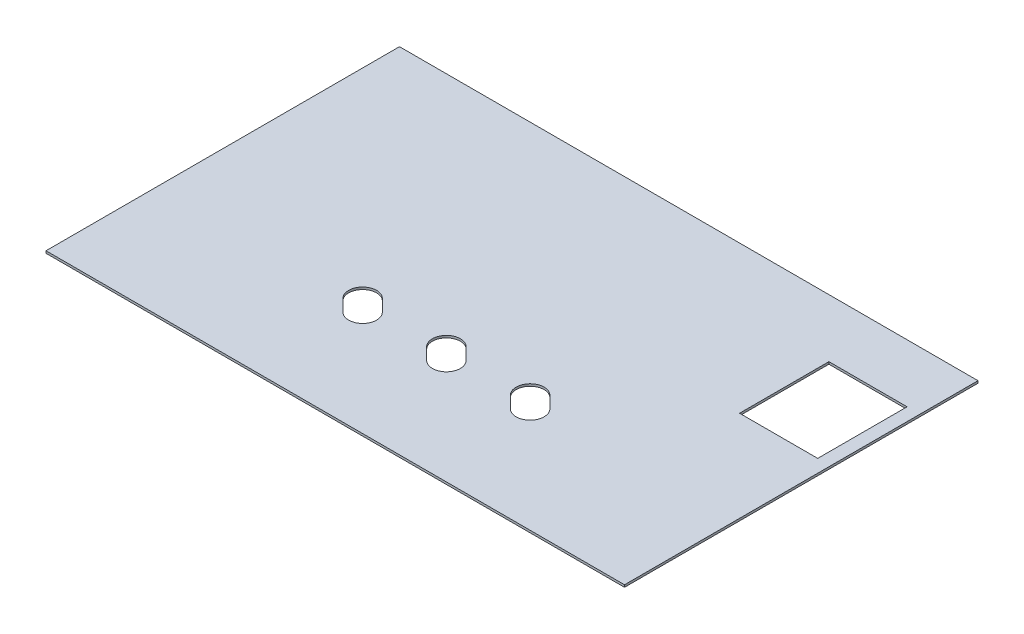
ISO-10303-21;
HEADER;
FILE_DESCRIPTION(('STEP AP214'),'2;1');
FILE_NAME('part.step','',(''),(''),'','','');
FILE_SCHEMA(('AUTOMOTIVE_DESIGN { 1 0 10303 214 1 1 1 1 }'));
ENDSEC;
DATA;
#1=APPLICATION_CONTEXT('core data for automotive mechanical design processes');
#2=APPLICATION_PROTOCOL_DEFINITION('international standard','automotive_design',2000,#1);
#3=PRODUCT_CONTEXT('',#1,'mechanical');
#4=PRODUCT('Part','Part','',(#3));
#5=PRODUCT_RELATED_PRODUCT_CATEGORY('part','',(#4));
#6=PRODUCT_DEFINITION_FORMATION('','',#4);
#7=PRODUCT_DEFINITION_CONTEXT('part definition',#1,'design');
#8=PRODUCT_DEFINITION('design','',#6,#7);
#9=PRODUCT_DEFINITION_SHAPE('','',#8);
#10=(LENGTH_UNIT() NAMED_UNIT(*) SI_UNIT(.MILLI.,.METRE.));
#11=(NAMED_UNIT(*) PLANE_ANGLE_UNIT() SI_UNIT($,.RADIAN.));
#12=(NAMED_UNIT(*) SI_UNIT($,.STERADIAN.) SOLID_ANGLE_UNIT());
#13=UNCERTAINTY_MEASURE_WITH_UNIT(LENGTH_MEASURE(1.E-05),#10,'distance_accuracy_value','');
#14=(GEOMETRIC_REPRESENTATION_CONTEXT(3) GLOBAL_UNCERTAINTY_ASSIGNED_CONTEXT((#13)) GLOBAL_UNIT_ASSIGNED_CONTEXT((#10,
#11,#12)) REPRESENTATION_CONTEXT('',''));
#15=CARTESIAN_POINT('',(0.,0.,0.));
#16=DIRECTION('',(0.,0.,1.));
#17=DIRECTION('',(1.,0.,0.));
#18=AXIS2_PLACEMENT_3D('',#15,#16,#17);
#19=CARTESIAN_POINT('',(51.8,-0.4,-31.65));
#20=DIRECTION('',(1.,0.,0.));
#21=DIRECTION('',(0.,0.,-1.));
#22=AXIS2_PLACEMENT_3D('',#19,#20,#21);
#23=PLANE('',#22);
#24=DIRECTION('',(0.,0.,-1.));
#25=VECTOR('',#24,1.);
#26=CARTESIAN_POINT('',(51.8,0.,-31.65));
#27=LINE('',#26,#25);
#28=CARTESIAN_POINT('',(51.8,0.,31.65));
#29=VERTEX_POINT('',#28);
#30=CARTESIAN_POINT('',(51.8,0.,-31.65));
#31=VERTEX_POINT('',#30);
#32=EDGE_CURVE('E296',#29,#31,#27,.T.);
#33=ORIENTED_EDGE('',*,*,#32,.F.);
#34=DIRECTION('',(0.,1.,0.));
#35=VECTOR('',#34,1.);
#36=CARTESIAN_POINT('',(51.8,-0.4,31.65));
#37=LINE('',#36,#35);
#38=CARTESIAN_POINT('',(51.8,-0.4,31.65));
#39=VERTEX_POINT('',#38);
#40=EDGE_CURVE('E11',#39,#29,#37,.T.);
#41=ORIENTED_EDGE('',*,*,#40,.F.);
#42=DIRECTION('',(0.,0.,-1.));
#43=VECTOR('',#42,1.);
#44=CARTESIAN_POINT('',(51.8,-0.4,-31.65));
#45=LINE('',#44,#43);
#46=CARTESIAN_POINT('',(51.8,-0.4,-31.65));
#47=VERTEX_POINT('',#46);
#48=EDGE_CURVE('E303',#39,#47,#45,.T.);
#49=ORIENTED_EDGE('',*,*,#48,.T.);
#50=DIRECTION('',(0.,1.,0.));
#51=VECTOR('',#50,1.);
#52=CARTESIAN_POINT('',(51.8,-0.4,-31.65));
#53=LINE('',#52,#51);
#54=EDGE_CURVE('E36',#47,#31,#53,.T.);
#55=ORIENTED_EDGE('',*,*,#54,.T.);
#56=EDGE_LOOP('',(#33,#41,#49,#55));
#57=FACE_BOUND('',#56,.T.);
#58=ADVANCED_FACE('F33',(#57),#23,.T.);
#59=CARTESIAN_POINT('',(-51.8,-0.4,31.65));
#60=DIRECTION('',(0.,0.,1.));
#61=DIRECTION('',(1.,0.,0.));
#62=AXIS2_PLACEMENT_3D('',#59,#60,#61);
#63=PLANE('',#62);
#64=DIRECTION('',(1.,0.,0.));
#65=VECTOR('',#64,1.);
#66=CARTESIAN_POINT('',(-51.8,0.,31.65));
#67=LINE('',#66,#65);
#68=CARTESIAN_POINT('',(-51.8,0.,31.65));
#69=VERTEX_POINT('',#68);
#70=EDGE_CURVE('E307',#69,#29,#67,.T.);
#71=ORIENTED_EDGE('',*,*,#70,.F.);
#72=DIRECTION('',(0.,1.,0.));
#73=VECTOR('',#72,1.);
#74=CARTESIAN_POINT('',(-51.8,-0.4,31.65));
#75=LINE('',#74,#73);
#76=CARTESIAN_POINT('',(-51.8,-0.4,31.65));
#77=VERTEX_POINT('',#76);
#78=EDGE_CURVE('E41',#77,#69,#75,.T.);
#79=ORIENTED_EDGE('',*,*,#78,.F.);
#80=DIRECTION('',(1.,0.,0.));
#81=VECTOR('',#80,1.);
#82=CARTESIAN_POINT('',(-51.8,-0.4,31.65));
#83=LINE('',#82,#81);
#84=EDGE_CURVE('E313',#77,#39,#83,.T.);
#85=ORIENTED_EDGE('',*,*,#84,.T.);
#86=ORIENTED_EDGE('',*,*,#40,.T.);
#87=EDGE_LOOP('',(#71,#79,#85,#86));
#88=FACE_BOUND('',#87,.T.);
#89=ADVANCED_FACE('F338',(#88),#63,.T.);
#90=CARTESIAN_POINT('',(-51.8,-0.4,-31.65));
#91=DIRECTION('',(-1.,0.,0.));
#92=DIRECTION('',(0.,0.,1.));
#93=AXIS2_PLACEMENT_3D('',#90,#91,#92);
#94=PLANE('',#93);
#95=DIRECTION('',(0.,0.,1.));
#96=VECTOR('',#95,1.);
#97=CARTESIAN_POINT('',(-51.8,0.,-31.65));
#98=LINE('',#97,#96);
#99=CARTESIAN_POINT('',(-51.8,0.,-31.65));
#100=VERTEX_POINT('',#99);
#101=EDGE_CURVE('E321',#100,#69,#98,.T.);
#102=ORIENTED_EDGE('',*,*,#101,.F.);
#103=DIRECTION('',(0.,1.,0.));
#104=VECTOR('',#103,1.);
#105=CARTESIAN_POINT('',(-51.8,-0.4,-31.65));
#106=LINE('',#105,#104);
#107=CARTESIAN_POINT('',(-51.8,-0.4,-31.65));
#108=VERTEX_POINT('',#107);
#109=EDGE_CURVE('E326',#108,#100,#106,.T.);
#110=ORIENTED_EDGE('',*,*,#109,.F.);
#111=DIRECTION('',(0.,0.,1.));
#112=VECTOR('',#111,1.);
#113=CARTESIAN_POINT('',(-51.8,-0.4,-31.65));
#114=LINE('',#113,#112);
#115=EDGE_CURVE('E310',#108,#77,#114,.T.);
#116=ORIENTED_EDGE('',*,*,#115,.T.);
#117=ORIENTED_EDGE('',*,*,#78,.T.);
#118=EDGE_LOOP('',(#102,#110,#116,#117));
#119=FACE_BOUND('',#118,.T.);
#120=ADVANCED_FACE('F344',(#119),#94,.T.);
#121=CARTESIAN_POINT('',(-51.8,-0.4,-31.65));
#122=DIRECTION('',(0.,0.,-1.));
#123=DIRECTION('',(-1.,0.,0.));
#124=AXIS2_PLACEMENT_3D('',#121,#122,#123);
#125=PLANE('',#124);
#126=DIRECTION('',(-1.,0.,0.));
#127=VECTOR('',#126,1.);
#128=CARTESIAN_POINT('',(-51.8,0.,-31.65));
#129=LINE('',#128,#127);
#130=EDGE_CURVE('E318',#31,#100,#129,.T.);
#131=ORIENTED_EDGE('',*,*,#130,.F.);
#132=ORIENTED_EDGE('',*,*,#54,.F.);
#133=DIRECTION('',(-1.,0.,0.));
#134=VECTOR('',#133,1.);
#135=CARTESIAN_POINT('',(-51.8,-0.4,-31.65));
#136=LINE('',#135,#134);
#137=EDGE_CURVE('E306',#47,#108,#136,.T.);
#138=ORIENTED_EDGE('',*,*,#137,.T.);
#139=ORIENTED_EDGE('',*,*,#109,.T.);
#140=EDGE_LOOP('',(#131,#132,#138,#139));
#141=FACE_BOUND('',#140,.T.);
#142=ADVANCED_FACE('F334',(#141),#125,.T.);
#143=CARTESIAN_POINT('',(0.,-0.4,0.));
#144=DIRECTION('',(0.,1.,0.));
#145=DIRECTION('',(0.,0.,1.));
#146=AXIS2_PLACEMENT_3D('',#143,#144,#145);
#147=PLANE('',#146);
#148=DIRECTION('',(-0.707106781186544,0.,-0.707106781186551));
#149=VECTOR('',#148,1.);
#150=CARTESIAN_POINT('',(15.7071067811866,-0.4,8.92157287525379));
#151=LINE('',#150,#149);
#152=CARTESIAN_POINT('',(17.8284271247462,-0.4,11.0428932188134));
#153=VERTEX_POINT('',#152);
#154=CARTESIAN_POINT('',(15.7071067811866,-0.4,8.92157287525379));
#155=VERTEX_POINT('',#154);
#156=EDGE_CURVE('E202',#153,#155,#151,.T.);
#157=ORIENTED_EDGE('',*,*,#156,.T.);
#158=CARTESIAN_POINT('',(13.9393398282202,-0.4,10.6893398282202));
#159=DIRECTION('',(0.,1.,0.));
#160=DIRECTION('',(0.,0.,1.));
#161=AXIS2_PLACEMENT_3D('',#158,#159,#160);
#162=CIRCLE('',#161,2.5);
#163=CARTESIAN_POINT('',(12.1715728752538,-0.4,12.4571067811865));
#164=VERTEX_POINT('',#163);
#165=EDGE_CURVE('E207',#155,#164,#162,.T.);
#166=ORIENTED_EDGE('',*,*,#165,.T.);
#167=DIRECTION('',(0.707106781186544,0.,0.707106781186551));
#168=VECTOR('',#167,1.);
#169=CARTESIAN_POINT('',(12.1715728752538,-0.4,12.4571067811865));
#170=LINE('',#169,#168);
#171=CARTESIAN_POINT('',(14.2928932188134,-0.4,14.5784271247462));
#172=VERTEX_POINT('',#171);
#173=EDGE_CURVE('E181',#164,#172,#170,.T.);
#174=ORIENTED_EDGE('',*,*,#173,.T.);
#175=CARTESIAN_POINT('',(16.0606601717798,-0.4,12.8106601717798));
#176=DIRECTION('',(0.,1.,0.));
#177=DIRECTION('',(0.,0.,1.));
#178=AXIS2_PLACEMENT_3D('',#175,#176,#177);
#179=CIRCLE('',#178,2.5);
#180=EDGE_CURVE('E49',#172,#153,#179,.T.);
#181=ORIENTED_EDGE('',*,*,#180,.T.);
#182=EDGE_LOOP('',(#157,#166,#174,#181));
#183=FACE_BOUND('',#182,.T.);
#184=DIRECTION('',(-0.707106781186544,0.,-0.707106781186551));
#185=VECTOR('',#184,1.);
#186=CARTESIAN_POINT('',(-14.2928932188134,-0.4,8.92157287525379));
#187=LINE('',#186,#185);
#188=CARTESIAN_POINT('',(-12.1715728752538,-0.4,11.0428932188134));
#189=VERTEX_POINT('',#188);
#190=CARTESIAN_POINT('',(-14.2928932188134,-0.4,8.92157287525379));
#191=VERTEX_POINT('',#190);
#192=EDGE_CURVE('E232',#189,#191,#187,.T.);
#193=ORIENTED_EDGE('',*,*,#192,.T.);
#194=CARTESIAN_POINT('',(-16.0606601717798,-0.4,10.6893398282202));
#195=DIRECTION('',(0.,1.,0.));
#196=DIRECTION('',(0.,0.,1.));
#197=AXIS2_PLACEMENT_3D('',#194,#195,#196);
#198=CIRCLE('',#197,2.5);
#199=CARTESIAN_POINT('',(-17.8284271247462,-0.4,12.4571067811865));
#200=VERTEX_POINT('',#199);
#201=EDGE_CURVE('E182',#191,#200,#198,.T.);
#202=ORIENTED_EDGE('',*,*,#201,.T.);
#203=DIRECTION('',(0.707106781186544,0.,0.707106781186551));
#204=VECTOR('',#203,1.);
#205=CARTESIAN_POINT('',(-17.8284271247462,-0.4,12.4571067811865));
#206=LINE('',#205,#204);
#207=CARTESIAN_POINT('',(-15.7071067811866,-0.4,14.5784271247462));
#208=VERTEX_POINT('',#207);
#209=EDGE_CURVE('E213',#200,#208,#206,.T.);
#210=ORIENTED_EDGE('',*,*,#209,.T.);
#211=CARTESIAN_POINT('',(-13.9393398282202,-0.4,12.8106601717798));
#212=DIRECTION('',(0.,1.,0.));
#213=DIRECTION('',(0.,0.,1.));
#214=AXIS2_PLACEMENT_3D('',#211,#212,#213);
#215=CIRCLE('',#214,2.5);
#216=EDGE_CURVE('E57',#208,#189,#215,.T.);
#217=ORIENTED_EDGE('',*,*,#216,.T.);
#218=EDGE_LOOP('',(#193,#202,#210,#217));
#219=FACE_BOUND('',#218,.T.);
#220=DIRECTION('',(-0.707106781186544,0.,-0.707106781186551));
#221=VECTOR('',#220,1.);
#222=CARTESIAN_POINT('',(0.707106781186563,-0.4,8.92157287525379));
#223=LINE('',#222,#221);
#224=CARTESIAN_POINT('',(2.82842712474619,-0.4,11.0428932188134));
#225=VERTEX_POINT('',#224);
#226=CARTESIAN_POINT('',(0.707106781186563,-0.4,8.92157287525379));
#227=VERTEX_POINT('',#226);
#228=EDGE_CURVE('E249',#225,#227,#223,.T.);
#229=ORIENTED_EDGE('',*,*,#228,.T.);
#230=CARTESIAN_POINT('',(-1.06066017177982,-0.4,10.6893398282202));
#231=DIRECTION('',(0.,1.,0.));
#232=DIRECTION('',(0.,0.,1.));
#233=AXIS2_PLACEMENT_3D('',#230,#231,#232);
#234=CIRCLE('',#233,2.5);
#235=CARTESIAN_POINT('',(-2.82842712474619,-0.4,12.4571067811865));
#236=VERTEX_POINT('',#235);
#237=EDGE_CURVE('E239',#227,#236,#234,.T.);
#238=ORIENTED_EDGE('',*,*,#237,.T.);
#239=DIRECTION('',(0.707106781186544,0.,0.707106781186551));
#240=VECTOR('',#239,1.);
#241=CARTESIAN_POINT('',(-2.82842712474619,-0.4,12.4571067811865));
#242=LINE('',#241,#240);
#243=CARTESIAN_POINT('',(-0.707106781186562,-0.4,14.5784271247462));
#244=VERTEX_POINT('',#243);
#245=EDGE_CURVE('E242',#236,#244,#242,.T.);
#246=ORIENTED_EDGE('',*,*,#245,.T.);
#247=CARTESIAN_POINT('',(1.06066017177981,-0.4,12.8106601717798));
#248=DIRECTION('',(0.,1.,0.));
#249=DIRECTION('',(0.,0.,1.));
#250=AXIS2_PLACEMENT_3D('',#247,#248,#249);
#251=CIRCLE('',#250,2.5);
#252=EDGE_CURVE('E246',#244,#225,#251,.T.);
#253=ORIENTED_EDGE('',*,*,#252,.T.);
#254=EDGE_LOOP('',(#229,#238,#246,#253));
#255=FACE_BOUND('',#254,.T.);
#256=DIRECTION('',(1.,0.,0.));
#257=VECTOR('',#256,1.);
#258=CARTESIAN_POINT('',(49.5,-0.4,-5.25000000000004));
#259=LINE('',#258,#257);
#260=CARTESIAN_POINT('',(35.5,-0.4,-5.25000000000004));
#261=VERTEX_POINT('',#260);
#262=CARTESIAN_POINT('',(49.5,-0.4,-5.25000000000004));
#263=VERTEX_POINT('',#262);
#264=EDGE_CURVE('E281',#261,#263,#259,.T.);
#265=ORIENTED_EDGE('',*,*,#264,.T.);
#266=DIRECTION('',(0.,0.,-1.));
#267=VECTOR('',#266,1.);
#268=CARTESIAN_POINT('',(49.5,-0.4,-21.25));
#269=LINE('',#268,#267);
#270=CARTESIAN_POINT('',(49.5,-0.4,-21.25));
#271=VERTEX_POINT('',#270);
#272=EDGE_CURVE('E271',#263,#271,#269,.T.);
#273=ORIENTED_EDGE('',*,*,#272,.T.);
#274=DIRECTION('',(-1.,0.,0.));
#275=VECTOR('',#274,1.);
#276=CARTESIAN_POINT('',(35.5,-0.4,-21.25));
#277=LINE('',#276,#275);
#278=CARTESIAN_POINT('',(35.5,-0.4,-21.25));
#279=VERTEX_POINT('',#278);
#280=EDGE_CURVE('E274',#271,#279,#277,.T.);
#281=ORIENTED_EDGE('',*,*,#280,.T.);
#282=DIRECTION('',(0.,0.,1.));
#283=VECTOR('',#282,1.);
#284=CARTESIAN_POINT('',(35.5,-0.4,-5.25000000000004));
#285=LINE('',#284,#283);
#286=EDGE_CURVE('E278',#279,#261,#285,.T.);
#287=ORIENTED_EDGE('',*,*,#286,.T.);
#288=EDGE_LOOP('',(#265,#273,#281,#287));
#289=FACE_BOUND('',#288,.T.);
#290=ORIENTED_EDGE('',*,*,#48,.F.);
#291=ORIENTED_EDGE('',*,*,#84,.F.);
#292=ORIENTED_EDGE('',*,*,#115,.F.);
#293=ORIENTED_EDGE('',*,*,#137,.F.);
#294=EDGE_LOOP('',(#290,#291,#292,#293));
#295=FACE_BOUND('',#294,.T.);
#296=ADVANCED_FACE('F341',(#183,#219,#255,#289,#295),#147,.F.);
#297=CARTESIAN_POINT('',(0.,0.,0.));
#298=DIRECTION('',(0.,1.,0.));
#299=DIRECTION('',(0.,0.,1.));
#300=AXIS2_PLACEMENT_3D('',#297,#298,#299);
#301=PLANE('',#300);
#302=CARTESIAN_POINT('',(13.9393398282202,0.,10.6893398282202));
#303=DIRECTION('',(0.,1.,0.));
#304=DIRECTION('',(0.,0.,1.));
#305=AXIS2_PLACEMENT_3D('',#302,#303,#304);
#306=CIRCLE('',#305,2.5);
#307=CARTESIAN_POINT('',(15.7071067811866,0.,8.92157287525379));
#308=VERTEX_POINT('',#307);
#309=CARTESIAN_POINT('',(12.1715728752538,0.,12.4571067811865));
#310=VERTEX_POINT('',#309);
#311=EDGE_CURVE('E205',#308,#310,#306,.T.);
#312=ORIENTED_EDGE('',*,*,#311,.F.);
#313=DIRECTION('',(-0.707106781186544,0.,-0.707106781186551));
#314=VECTOR('',#313,1.);
#315=CARTESIAN_POINT('',(15.7071067811866,0.,8.92157287525379));
#316=LINE('',#315,#314);
#317=CARTESIAN_POINT('',(17.8284271247462,0.,11.0428932188134));
#318=VERTEX_POINT('',#317);
#319=EDGE_CURVE('E191',#318,#308,#316,.T.);
#320=ORIENTED_EDGE('',*,*,#319,.F.);
#321=CARTESIAN_POINT('',(16.0606601717798,0.,12.8106601717798));
#322=DIRECTION('',(0.,1.,0.));
#323=DIRECTION('',(0.,0.,1.));
#324=AXIS2_PLACEMENT_3D('',#321,#322,#323);
#325=CIRCLE('',#324,2.5);
#326=CARTESIAN_POINT('',(14.2928932188134,0.,14.5784271247462));
#327=VERTEX_POINT('',#326);
#328=EDGE_CURVE('E185',#327,#318,#325,.T.);
#329=ORIENTED_EDGE('',*,*,#328,.F.);
#330=DIRECTION('',(0.707106781186544,0.,0.707106781186551));
#331=VECTOR('',#330,1.);
#332=CARTESIAN_POINT('',(12.1715728752538,0.,12.4571067811865));
#333=LINE('',#332,#331);
#334=EDGE_CURVE('E172',#310,#327,#333,.T.);
#335=ORIENTED_EDGE('',*,*,#334,.F.);
#336=EDGE_LOOP('',(#312,#320,#329,#335));
#337=FACE_BOUND('',#336,.T.);
#338=CARTESIAN_POINT('',(-16.0606601717798,0.,10.6893398282202));
#339=DIRECTION('',(0.,1.,0.));
#340=DIRECTION('',(0.,0.,1.));
#341=AXIS2_PLACEMENT_3D('',#338,#339,#340);
#342=CIRCLE('',#341,2.5);
#343=CARTESIAN_POINT('',(-14.2928932188134,0.,8.92157287525379));
#344=VERTEX_POINT('',#343);
#345=CARTESIAN_POINT('',(-17.8284271247462,0.,12.4571067811865));
#346=VERTEX_POINT('',#345);
#347=EDGE_CURVE('E235',#344,#346,#342,.T.);
#348=ORIENTED_EDGE('',*,*,#347,.F.);
#349=DIRECTION('',(-0.707106781186544,0.,-0.707106781186551));
#350=VECTOR('',#349,1.);
#351=CARTESIAN_POINT('',(-14.2928932188134,0.,8.92157287525379));
#352=LINE('',#351,#350);
#353=CARTESIAN_POINT('',(-12.1715728752538,0.,11.0428932188134));
#354=VERTEX_POINT('',#353);
#355=EDGE_CURVE('E227',#354,#344,#352,.T.);
#356=ORIENTED_EDGE('',*,*,#355,.F.);
#357=CARTESIAN_POINT('',(-13.9393398282202,0.,12.8106601717798));
#358=DIRECTION('',(0.,1.,0.));
#359=DIRECTION('',(0.,0.,1.));
#360=AXIS2_PLACEMENT_3D('',#357,#358,#359);
#361=CIRCLE('',#360,2.5);
#362=CARTESIAN_POINT('',(-15.7071067811866,0.,14.5784271247462));
#363=VERTEX_POINT('',#362);
#364=EDGE_CURVE('E221',#363,#354,#361,.T.);
#365=ORIENTED_EDGE('',*,*,#364,.F.);
#366=DIRECTION('',(0.707106781186544,0.,0.707106781186551));
#367=VECTOR('',#366,1.);
#368=CARTESIAN_POINT('',(-17.8284271247462,0.,12.4571067811865));
#369=LINE('',#368,#367);
#370=EDGE_CURVE('E211',#346,#363,#369,.T.);
#371=ORIENTED_EDGE('',*,*,#370,.F.);
#372=EDGE_LOOP('',(#348,#356,#365,#371));
#373=FACE_BOUND('',#372,.T.);
#374=CARTESIAN_POINT('',(-1.06066017177982,0.,10.6893398282202));
#375=DIRECTION('',(0.,1.,0.));
#376=DIRECTION('',(0.,0.,1.));
#377=AXIS2_PLACEMENT_3D('',#374,#375,#376);
#378=CIRCLE('',#377,2.5);
#379=CARTESIAN_POINT('',(0.707106781186563,0.,8.92157287525379));
#380=VERTEX_POINT('',#379);
#381=CARTESIAN_POINT('',(-2.82842712474619,0.,12.4571067811865));
#382=VERTEX_POINT('',#381);
#383=EDGE_CURVE('E210',#380,#382,#378,.T.);
#384=ORIENTED_EDGE('',*,*,#383,.F.);
#385=DIRECTION('',(-0.707106781186544,0.,-0.707106781186551));
#386=VECTOR('',#385,1.);
#387=CARTESIAN_POINT('',(0.707106781186563,0.,8.92157287525379));
#388=LINE('',#387,#386);
#389=CARTESIAN_POINT('',(2.82842712474619,0.,11.0428932188134));
#390=VERTEX_POINT('',#389);
#391=EDGE_CURVE('E243',#390,#380,#388,.T.);
#392=ORIENTED_EDGE('',*,*,#391,.F.);
#393=CARTESIAN_POINT('',(1.06066017177981,0.,12.8106601717798));
#394=DIRECTION('',(0.,1.,0.));
#395=DIRECTION('',(0.,0.,1.));
#396=AXIS2_PLACEMENT_3D('',#393,#394,#395);
#397=CIRCLE('',#396,2.5);
#398=CARTESIAN_POINT('',(-0.707106781186562,0.,14.5784271247462));
#399=VERTEX_POINT('',#398);
#400=EDGE_CURVE('E257',#399,#390,#397,.T.);
#401=ORIENTED_EDGE('',*,*,#400,.F.);
#402=DIRECTION('',(0.707106781186544,0.,0.707106781186551));
#403=VECTOR('',#402,1.);
#404=CARTESIAN_POINT('',(-2.82842712474619,0.,12.4571067811865));
#405=LINE('',#404,#403);
#406=EDGE_CURVE('E254',#382,#399,#405,.T.);
#407=ORIENTED_EDGE('',*,*,#406,.F.);
#408=EDGE_LOOP('',(#384,#392,#401,#407));
#409=FACE_BOUND('',#408,.T.);
#410=DIRECTION('',(0.,0.,-1.));
#411=VECTOR('',#410,1.);
#412=CARTESIAN_POINT('',(49.5,0.,-21.25));
#413=LINE('',#412,#411);
#414=CARTESIAN_POINT('',(49.5,0.,-5.25000000000004));
#415=VERTEX_POINT('',#414);
#416=CARTESIAN_POINT('',(49.5,0.,-21.25));
#417=VERTEX_POINT('',#416);
#418=EDGE_CURVE('E264',#415,#417,#413,.T.);
#419=ORIENTED_EDGE('',*,*,#418,.F.);
#420=DIRECTION('',(1.,0.,0.));
#421=VECTOR('',#420,1.);
#422=CARTESIAN_POINT('',(49.5,0.,-5.25000000000004));
#423=LINE('',#422,#421);
#424=CARTESIAN_POINT('',(35.5,0.,-5.25000000000004));
#425=VERTEX_POINT('',#424);
#426=EDGE_CURVE('E275',#425,#415,#423,.T.);
#427=ORIENTED_EDGE('',*,*,#426,.F.);
#428=DIRECTION('',(0.,0.,1.));
#429=VECTOR('',#428,1.);
#430=CARTESIAN_POINT('',(35.5,0.,-5.25000000000004));
#431=LINE('',#430,#429);
#432=CARTESIAN_POINT('',(35.5,0.,-21.25));
#433=VERTEX_POINT('',#432);
#434=EDGE_CURVE('E289',#433,#425,#431,.T.);
#435=ORIENTED_EDGE('',*,*,#434,.F.);
#436=DIRECTION('',(-1.,0.,0.));
#437=VECTOR('',#436,1.);
#438=CARTESIAN_POINT('',(35.5,0.,-21.25));
#439=LINE('',#438,#437);
#440=EDGE_CURVE('E286',#417,#433,#439,.T.);
#441=ORIENTED_EDGE('',*,*,#440,.F.);
#442=EDGE_LOOP('',(#419,#427,#435,#441));
#443=FACE_BOUND('',#442,.T.);
#444=ORIENTED_EDGE('',*,*,#32,.T.);
#445=ORIENTED_EDGE('',*,*,#130,.T.);
#446=ORIENTED_EDGE('',*,*,#101,.T.);
#447=ORIENTED_EDGE('',*,*,#70,.T.);
#448=EDGE_LOOP('',(#444,#445,#446,#447));
#449=FACE_BOUND('',#448,.T.);
#450=ADVANCED_FACE('F189',(#337,#373,#409,#443,#449),#301,.T.);
#451=CARTESIAN_POINT('',(49.5,-0.4,-21.25));
#452=DIRECTION('',(1.,0.,0.));
#453=DIRECTION('',(0.,0.,-1.));
#454=AXIS2_PLACEMENT_3D('',#451,#452,#453);
#455=PLANE('',#454);
#456=ORIENTED_EDGE('',*,*,#418,.T.);
#457=DIRECTION('',(0.,1.,0.));
#458=VECTOR('',#457,1.);
#459=CARTESIAN_POINT('',(49.5,-0.4,-21.25));
#460=LINE('',#459,#458);
#461=EDGE_CURVE('E284',#271,#417,#460,.T.);
#462=ORIENTED_EDGE('',*,*,#461,.F.);
#463=ORIENTED_EDGE('',*,*,#272,.F.);
#464=DIRECTION('',(0.,1.,0.));
#465=VECTOR('',#464,1.);
#466=CARTESIAN_POINT('',(49.5,-0.4,-5.25000000000004));
#467=LINE('',#466,#465);
#468=EDGE_CURVE('E294',#263,#415,#467,.T.);
#469=ORIENTED_EDGE('',*,*,#468,.T.);
#470=EDGE_LOOP('',(#456,#462,#463,#469));
#471=FACE_BOUND('',#470,.T.);
#472=ADVANCED_FACE('F376',(#471),#455,.F.);
#473=CARTESIAN_POINT('',(49.5,-0.4,-5.25000000000004));
#474=DIRECTION('',(0.,0.,1.));
#475=DIRECTION('',(1.,0.,0.));
#476=AXIS2_PLACEMENT_3D('',#473,#474,#475);
#477=PLANE('',#476);
#478=ORIENTED_EDGE('',*,*,#426,.T.);
#479=ORIENTED_EDGE('',*,*,#468,.F.);
#480=ORIENTED_EDGE('',*,*,#264,.F.);
#481=DIRECTION('',(0.,1.,0.));
#482=VECTOR('',#481,1.);
#483=CARTESIAN_POINT('',(35.5,-0.4,-5.25000000000004));
#484=LINE('',#483,#482);
#485=EDGE_CURVE('E297',#261,#425,#484,.T.);
#486=ORIENTED_EDGE('',*,*,#485,.T.);
#487=EDGE_LOOP('',(#478,#479,#480,#486));
#488=FACE_BOUND('',#487,.T.);
#489=ADVANCED_FACE('F381',(#488),#477,.F.);
#490=CARTESIAN_POINT('',(35.5,-0.4,-5.25000000000004));
#491=DIRECTION('',(-1.,0.,0.));
#492=DIRECTION('',(0.,0.,1.));
#493=AXIS2_PLACEMENT_3D('',#490,#491,#492);
#494=PLANE('',#493);
#495=ORIENTED_EDGE('',*,*,#434,.T.);
#496=ORIENTED_EDGE('',*,*,#485,.F.);
#497=ORIENTED_EDGE('',*,*,#286,.F.);
#498=DIRECTION('',(0.,1.,0.));
#499=VECTOR('',#498,1.);
#500=CARTESIAN_POINT('',(35.5,-0.4,-21.25));
#501=LINE('',#500,#499);
#502=EDGE_CURVE('E299',#279,#433,#501,.T.);
#503=ORIENTED_EDGE('',*,*,#502,.T.);
#504=EDGE_LOOP('',(#495,#496,#497,#503));
#505=FACE_BOUND('',#504,.T.);
#506=ADVANCED_FACE('F393',(#505),#494,.F.);
#507=CARTESIAN_POINT('',(35.5,-0.4,-21.25));
#508=DIRECTION('',(0.,0.,-1.));
#509=DIRECTION('',(-1.,0.,0.));
#510=AXIS2_PLACEMENT_3D('',#507,#508,#509);
#511=PLANE('',#510);
#512=ORIENTED_EDGE('',*,*,#440,.T.);
#513=ORIENTED_EDGE('',*,*,#502,.F.);
#514=ORIENTED_EDGE('',*,*,#280,.F.);
#515=ORIENTED_EDGE('',*,*,#461,.T.);
#516=EDGE_LOOP('',(#512,#513,#514,#515));
#517=FACE_BOUND('',#516,.T.);
#518=ADVANCED_FACE('F403',(#517),#511,.F.);
#519=CARTESIAN_POINT('',(-1.06066017177982,-0.4,10.6893398282202));
#520=DIRECTION('',(0.,1.,0.));
#521=DIRECTION('',(0.,0.,1.));
#522=AXIS2_PLACEMENT_3D('',#519,#520,#521);
#523=CYLINDRICAL_SURFACE('',#522,2.5);
#524=ORIENTED_EDGE('',*,*,#383,.T.);
#525=DIRECTION('',(0.,1.,0.));
#526=VECTOR('',#525,1.);
#527=CARTESIAN_POINT('',(-2.82842712474619,-0.4,12.4571067811865));
#528=LINE('',#527,#526);
#529=EDGE_CURVE('E252',#236,#382,#528,.T.);
#530=ORIENTED_EDGE('',*,*,#529,.F.);
#531=ORIENTED_EDGE('',*,*,#237,.F.);
#532=DIRECTION('',(0.,1.,0.));
#533=VECTOR('',#532,1.);
#534=CARTESIAN_POINT('',(0.707106781186563,-0.4,8.92157287525379));
#535=LINE('',#534,#533);
#536=EDGE_CURVE('E262',#227,#380,#535,.T.);
#537=ORIENTED_EDGE('',*,*,#536,.T.);
#538=EDGE_LOOP('',(#524,#530,#531,#537));
#539=FACE_BOUND('',#538,.T.);
#540=ADVANCED_FACE('F413',(#539),#523,.F.);
#541=CARTESIAN_POINT('',(0.707106781186563,-0.4,8.92157287525379));
#542=DIRECTION('',(0.707106781186551,0.,-0.707106781186544));
#543=DIRECTION('',(-0.707106781186544,0.,-0.707106781186551));
#544=AXIS2_PLACEMENT_3D('',#541,#542,#543);
#545=PLANE('',#544);
#546=ORIENTED_EDGE('',*,*,#391,.T.);
#547=ORIENTED_EDGE('',*,*,#536,.F.);
#548=ORIENTED_EDGE('',*,*,#228,.F.);
#549=DIRECTION('',(0.,1.,0.));
#550=VECTOR('',#549,1.);
#551=CARTESIAN_POINT('',(2.82842712474619,-0.4,11.0428932188134));
#552=LINE('',#551,#550);
#553=EDGE_CURVE('E265',#225,#390,#552,.T.);
#554=ORIENTED_EDGE('',*,*,#553,.T.);
#555=EDGE_LOOP('',(#546,#547,#548,#554));
#556=FACE_BOUND('',#555,.T.);
#557=ADVANCED_FACE('F423',(#556),#545,.F.);
#558=CARTESIAN_POINT('',(1.06066017177981,-0.4,12.8106601717798));
#559=DIRECTION('',(0.,1.,0.));
#560=DIRECTION('',(0.,0.,1.));
#561=AXIS2_PLACEMENT_3D('',#558,#559,#560);
#562=CYLINDRICAL_SURFACE('',#561,2.5);
#563=ORIENTED_EDGE('',*,*,#400,.T.);
#564=ORIENTED_EDGE('',*,*,#553,.F.);
#565=ORIENTED_EDGE('',*,*,#252,.F.);
#566=DIRECTION('',(0.,1.,0.));
#567=VECTOR('',#566,1.);
#568=CARTESIAN_POINT('',(-0.707106781186562,-0.4,14.5784271247462));
#569=LINE('',#568,#567);
#570=EDGE_CURVE('E267',#244,#399,#569,.T.);
#571=ORIENTED_EDGE('',*,*,#570,.T.);
#572=EDGE_LOOP('',(#563,#564,#565,#571));
#573=FACE_BOUND('',#572,.T.);
#574=ADVANCED_FACE('F433',(#573),#562,.F.);
#575=CARTESIAN_POINT('',(-2.82842712474619,-0.4,12.4571067811865));
#576=DIRECTION('',(-0.707106781186551,0.,0.707106781186544));
#577=DIRECTION('',(0.707106781186544,0.,0.707106781186551));
#578=AXIS2_PLACEMENT_3D('',#575,#576,#577);
#579=PLANE('',#578);
#580=ORIENTED_EDGE('',*,*,#406,.T.);
#581=ORIENTED_EDGE('',*,*,#570,.F.);
#582=ORIENTED_EDGE('',*,*,#245,.F.);
#583=ORIENTED_EDGE('',*,*,#529,.T.);
#584=EDGE_LOOP('',(#580,#581,#582,#583));
#585=FACE_BOUND('',#584,.T.);
#586=ADVANCED_FACE('F443',(#585),#579,.F.);
#587=CARTESIAN_POINT('',(-16.0606601717798,-0.4,10.6893398282202));
#588=DIRECTION('',(0.,1.,0.));
#589=DIRECTION('',(0.,0.,1.));
#590=AXIS2_PLACEMENT_3D('',#587,#588,#589);
#591=CYLINDRICAL_SURFACE('',#590,2.5);
#592=ORIENTED_EDGE('',*,*,#347,.T.);
#593=DIRECTION('',(0.,1.,0.));
#594=VECTOR('',#593,1.);
#595=CARTESIAN_POINT('',(-17.8284271247462,-0.4,12.4571067811865));
#596=LINE('',#595,#594);
#597=EDGE_CURVE('E218',#200,#346,#596,.T.);
#598=ORIENTED_EDGE('',*,*,#597,.F.);
#599=ORIENTED_EDGE('',*,*,#201,.F.);
#600=DIRECTION('',(0.,1.,0.));
#601=VECTOR('',#600,1.);
#602=CARTESIAN_POINT('',(-14.2928932188134,-0.4,8.92157287525379));
#603=LINE('',#602,#601);
#604=EDGE_CURVE('E229',#191,#344,#603,.T.);
#605=ORIENTED_EDGE('',*,*,#604,.T.);
#606=EDGE_LOOP('',(#592,#598,#599,#605));
#607=FACE_BOUND('',#606,.T.);
#608=ADVANCED_FACE('F453',(#607),#591,.F.);
#609=CARTESIAN_POINT('',(-14.2928932188134,-0.4,8.92157287525379));
#610=DIRECTION('',(0.707106781186551,0.,-0.707106781186544));
#611=DIRECTION('',(-0.707106781186544,0.,-0.707106781186551));
#612=AXIS2_PLACEMENT_3D('',#609,#610,#611);
#613=PLANE('',#612);
#614=ORIENTED_EDGE('',*,*,#355,.T.);
#615=ORIENTED_EDGE('',*,*,#604,.F.);
#616=ORIENTED_EDGE('',*,*,#192,.F.);
#617=DIRECTION('',(0.,1.,0.));
#618=VECTOR('',#617,1.);
#619=CARTESIAN_POINT('',(-12.1715728752538,-0.4,11.0428932188134));
#620=LINE('',#619,#618);
#621=EDGE_CURVE('E223',#189,#354,#620,.T.);
#622=ORIENTED_EDGE('',*,*,#621,.T.);
#623=EDGE_LOOP('',(#614,#615,#616,#622));
#624=FACE_BOUND('',#623,.T.);
#625=ADVANCED_FACE('F476',(#624),#613,.F.);
#626=CARTESIAN_POINT('',(-13.9393398282202,-0.4,12.8106601717798));
#627=DIRECTION('',(0.,1.,0.));
#628=DIRECTION('',(0.,0.,1.));
#629=AXIS2_PLACEMENT_3D('',#626,#627,#628);
#630=CYLINDRICAL_SURFACE('',#629,2.5);
#631=ORIENTED_EDGE('',*,*,#364,.T.);
#632=ORIENTED_EDGE('',*,*,#621,.F.);
#633=ORIENTED_EDGE('',*,*,#216,.F.);
#634=DIRECTION('',(0.,1.,0.));
#635=VECTOR('',#634,1.);
#636=CARTESIAN_POINT('',(-15.7071067811866,-0.4,14.5784271247462));
#637=LINE('',#636,#635);
#638=EDGE_CURVE('E216',#208,#363,#637,.T.);
#639=ORIENTED_EDGE('',*,*,#638,.T.);
#640=EDGE_LOOP('',(#631,#632,#633,#639));
#641=FACE_BOUND('',#640,.T.);
#642=ADVANCED_FACE('F486',(#641),#630,.F.);
#643=CARTESIAN_POINT('',(-17.8284271247462,-0.4,12.4571067811865));
#644=DIRECTION('',(-0.707106781186551,0.,0.707106781186544));
#645=DIRECTION('',(0.707106781186544,0.,0.707106781186551));
#646=AXIS2_PLACEMENT_3D('',#643,#644,#645);
#647=PLANE('',#646);
#648=ORIENTED_EDGE('',*,*,#370,.T.);
#649=ORIENTED_EDGE('',*,*,#638,.F.);
#650=ORIENTED_EDGE('',*,*,#209,.F.);
#651=ORIENTED_EDGE('',*,*,#597,.T.);
#652=EDGE_LOOP('',(#648,#649,#650,#651));
#653=FACE_BOUND('',#652,.T.);
#654=ADVANCED_FACE('F496',(#653),#647,.F.);
#655=CARTESIAN_POINT('',(13.9393398282202,-0.4,10.6893398282202));
#656=DIRECTION('',(0.,1.,0.));
#657=DIRECTION('',(0.,0.,1.));
#658=AXIS2_PLACEMENT_3D('',#655,#656,#657);
#659=CYLINDRICAL_SURFACE('',#658,2.5);
#660=ORIENTED_EDGE('',*,*,#311,.T.);
#661=DIRECTION('',(0.,1.,0.));
#662=VECTOR('',#661,1.);
#663=CARTESIAN_POINT('',(12.1715728752538,-0.4,12.4571067811865));
#664=LINE('',#663,#662);
#665=EDGE_CURVE('E177',#164,#310,#664,.T.);
#666=ORIENTED_EDGE('',*,*,#665,.F.);
#667=ORIENTED_EDGE('',*,*,#165,.F.);
#668=DIRECTION('',(0.,1.,0.));
#669=VECTOR('',#668,1.);
#670=CARTESIAN_POINT('',(15.7071067811866,-0.4,8.92157287525379));
#671=LINE('',#670,#669);
#672=EDGE_CURVE('E199',#155,#308,#671,.T.);
#673=ORIENTED_EDGE('',*,*,#672,.T.);
#674=EDGE_LOOP('',(#660,#666,#667,#673));
#675=FACE_BOUND('',#674,.T.);
#676=ADVANCED_FACE('F505',(#675),#659,.F.);
#677=CARTESIAN_POINT('',(15.7071067811866,-0.4,8.92157287525379));
#678=DIRECTION('',(0.707106781186551,0.,-0.707106781186544));
#679=DIRECTION('',(-0.707106781186544,0.,-0.707106781186551));
#680=AXIS2_PLACEMENT_3D('',#677,#678,#679);
#681=PLANE('',#680);
#682=ORIENTED_EDGE('',*,*,#319,.T.);
#683=ORIENTED_EDGE('',*,*,#672,.F.);
#684=ORIENTED_EDGE('',*,*,#156,.F.);
#685=DIRECTION('',(0.,1.,0.));
#686=VECTOR('',#685,1.);
#687=CARTESIAN_POINT('',(17.8284271247462,-0.4,11.0428932188134));
#688=LINE('',#687,#686);
#689=EDGE_CURVE('E192',#153,#318,#688,.T.);
#690=ORIENTED_EDGE('',*,*,#689,.T.);
#691=EDGE_LOOP('',(#682,#683,#684,#690));
#692=FACE_BOUND('',#691,.T.);
#693=ADVANCED_FACE('F515',(#692),#681,.F.);
#694=CARTESIAN_POINT('',(16.0606601717798,-0.4,12.8106601717798));
#695=DIRECTION('',(0.,1.,0.));
#696=DIRECTION('',(0.,0.,1.));
#697=AXIS2_PLACEMENT_3D('',#694,#695,#696);
#698=CYLINDRICAL_SURFACE('',#697,2.5);
#699=ORIENTED_EDGE('',*,*,#328,.T.);
#700=ORIENTED_EDGE('',*,*,#689,.F.);
#701=ORIENTED_EDGE('',*,*,#180,.F.);
#702=DIRECTION('',(0.,1.,0.));
#703=VECTOR('',#702,1.);
#704=CARTESIAN_POINT('',(14.2928932188134,-0.4,14.5784271247462));
#705=LINE('',#704,#703);
#706=EDGE_CURVE('E174',#172,#327,#705,.T.);
#707=ORIENTED_EDGE('',*,*,#706,.T.);
#708=EDGE_LOOP('',(#699,#700,#701,#707));
#709=FACE_BOUND('',#708,.T.);
#710=ADVANCED_FACE('F184',(#709),#698,.F.);
#711=CARTESIAN_POINT('',(12.1715728752538,-0.4,12.4571067811865));
#712=DIRECTION('',(-0.707106781186551,0.,0.707106781186544));
#713=DIRECTION('',(0.707106781186544,0.,0.707106781186551));
#714=AXIS2_PLACEMENT_3D('',#711,#712,#713);
#715=PLANE('',#714);
#716=ORIENTED_EDGE('',*,*,#334,.T.);
#717=ORIENTED_EDGE('',*,*,#706,.F.);
#718=ORIENTED_EDGE('',*,*,#173,.F.);
#719=ORIENTED_EDGE('',*,*,#665,.T.);
#720=EDGE_LOOP('',(#716,#717,#718,#719));
#721=FACE_BOUND('',#720,.T.);
#722=ADVANCED_FACE('F173',(#721),#715,.F.);
#723=CLOSED_SHELL('',(#58,#89,#120,#142,#296,#450,#472,#489,#506,#518,#540,#557,#574,#586,#608,
#625,#642,#654,#676,#693,#710,#722));
#724=MANIFOLD_SOLID_BREP('B2',#723);
#725=ADVANCED_BREP_SHAPE_REPRESENTATION('',(#18,#724),#14);
#726=SHAPE_DEFINITION_REPRESENTATION(#9,#725);
ENDSEC;
END-ISO-10303-21;
